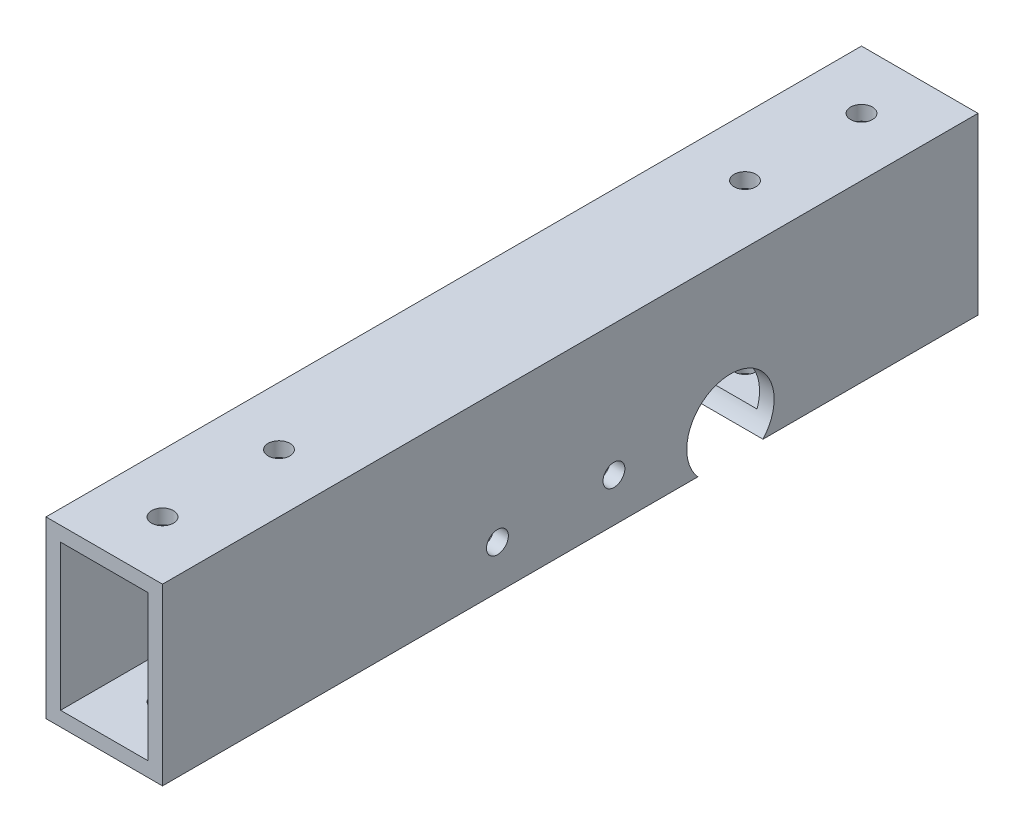
ISO-10303-21;
HEADER;
FILE_DESCRIPTION(('STEP AP214'),'2;1');
FILE_NAME('part.step','',(''),(''),'','','');
FILE_SCHEMA(('AUTOMOTIVE_DESIGN { 1 0 10303 214 1 1 1 1 }'));
ENDSEC;
DATA;
#1=APPLICATION_CONTEXT('core data for automotive mechanical design processes');
#2=APPLICATION_PROTOCOL_DEFINITION('international standard','automotive_design',2000,#1);
#3=PRODUCT_CONTEXT('',#1,'mechanical');
#4=PRODUCT('Part','Part','',(#3));
#5=PRODUCT_RELATED_PRODUCT_CATEGORY('part','',(#4));
#6=PRODUCT_DEFINITION_FORMATION('','',#4);
#7=PRODUCT_DEFINITION_CONTEXT('part definition',#1,'design');
#8=PRODUCT_DEFINITION('design','',#6,#7);
#9=PRODUCT_DEFINITION_SHAPE('','',#8);
#10=(LENGTH_UNIT() NAMED_UNIT(*) SI_UNIT(.MILLI.,.METRE.));
#11=(NAMED_UNIT(*) PLANE_ANGLE_UNIT() SI_UNIT($,.RADIAN.));
#12=(NAMED_UNIT(*) SI_UNIT($,.STERADIAN.) SOLID_ANGLE_UNIT());
#13=UNCERTAINTY_MEASURE_WITH_UNIT(LENGTH_MEASURE(1.E-05),#10,'distance_accuracy_value','');
#14=(GEOMETRIC_REPRESENTATION_CONTEXT(3) GLOBAL_UNCERTAINTY_ASSIGNED_CONTEXT((#13)) GLOBAL_UNIT_ASSIGNED_CONTEXT((#10,
#11,#12)) REPRESENTATION_CONTEXT('',''));
#15=CARTESIAN_POINT('',(0.,0.,0.));
#16=DIRECTION('',(0.,0.,1.));
#17=DIRECTION('',(1.,0.,0.));
#18=AXIS2_PLACEMENT_3D('',#15,#16,#17);
#19=CARTESIAN_POINT('',(-12.7,-19.05,177.8));
#20=DIRECTION('',(0.,1.,0.));
#21=DIRECTION('',(0.,0.,1.));
#22=AXIS2_PLACEMENT_3D('',#19,#20,#21);
#23=PLANE('',#22);
#24=CARTESIAN_POINT('',(0.,-19.05,165.1));
#25=DIRECTION('',(0.,1.,0.));
#26=DIRECTION('',(0.,0.,1.));
#27=AXIS2_PLACEMENT_3D('',#24,#25,#26);
#28=CIRCLE('',#27,2.38125);
#29=CARTESIAN_POINT('',(0.,-19.05,167.48125));
#30=VERTEX_POINT('',#29);
#31=EDGE_CURVE('E232',#30,#30,#28,.T.);
#32=ORIENTED_EDGE('',*,*,#31,.T.);
#33=EDGE_LOOP('',(#32));
#34=FACE_BOUND('',#33,.T.);
#35=CARTESIAN_POINT('',(0.,-19.05,139.7));
#36=DIRECTION('',(0.,1.,0.));
#37=DIRECTION('',(0.,0.,1.));
#38=AXIS2_PLACEMENT_3D('',#35,#36,#37);
#39=CIRCLE('',#38,2.38125);
#40=CARTESIAN_POINT('',(0.,-19.05,142.08125));
#41=VERTEX_POINT('',#40);
#42=EDGE_CURVE('E285',#41,#41,#39,.T.);
#43=ORIENTED_EDGE('',*,*,#42,.T.);
#44=EDGE_LOOP('',(#43));
#45=FACE_BOUND('',#44,.T.);
#46=DIRECTION('',(0.,0.,-1.));
#47=VECTOR('',#46,1.);
#48=CARTESIAN_POINT('',(-12.7,-19.05,177.8));
#49=LINE('',#48,#47);
#50=CARTESIAN_POINT('',(-12.7,-19.05,177.8));
#51=VERTEX_POINT('',#50);
#52=CARTESIAN_POINT('',(-12.7,-19.05,61.0745158285618));
#53=VERTEX_POINT('',#52);
#54=EDGE_CURVE('E162',#51,#53,#49,.T.);
#55=ORIENTED_EDGE('',*,*,#54,.T.);
#56=DIRECTION('',(1.,0.,0.));
#57=VECTOR('',#56,1.);
#58=CARTESIAN_POINT('',(-12.7,-19.05,61.0745158285618));
#59=LINE('',#58,#57);
#60=CARTESIAN_POINT('',(12.7,-19.05,61.0745158285618));
#61=VERTEX_POINT('',#60);
#62=EDGE_CURVE('E146',#53,#61,#59,.T.);
#63=ORIENTED_EDGE('',*,*,#62,.T.);
#64=DIRECTION('',(0.,0.,-1.));
#65=VECTOR('',#64,1.);
#66=CARTESIAN_POINT('',(12.7,-19.05,177.8));
#67=LINE('',#66,#65);
#68=CARTESIAN_POINT('',(12.7,-19.05,177.8));
#69=VERTEX_POINT('',#68);
#70=EDGE_CURVE('E179',#69,#61,#67,.T.);
#71=ORIENTED_EDGE('',*,*,#70,.F.);
#72=DIRECTION('',(1.,0.,0.));
#73=VECTOR('',#72,1.);
#74=CARTESIAN_POINT('',(-12.7,-19.05,177.8));
#75=LINE('',#74,#73);
#76=EDGE_CURVE('E169',#51,#69,#75,.T.);
#77=ORIENTED_EDGE('',*,*,#76,.F.);
#78=EDGE_LOOP('',(#55,#63,#71,#77));
#79=FACE_BOUND('',#78,.T.);
#80=ADVANCED_FACE('F56',(#34,#45,#79),#23,.F.);
#81=CARTESIAN_POINT('',(-12.7,-15.875,177.8));
#82=DIRECTION('',(0.,1.,0.));
#83=DIRECTION('',(0.,0.,1.));
#84=AXIS2_PLACEMENT_3D('',#81,#82,#83);
#85=PLANE('',#84);
#86=CARTESIAN_POINT('',(0.,-15.875,165.1));
#87=DIRECTION('',(0.,1.,0.));
#88=DIRECTION('',(0.,0.,1.));
#89=AXIS2_PLACEMENT_3D('',#86,#87,#88);
#90=CIRCLE('',#89,2.38125);
#91=CARTESIAN_POINT('',(0.,-15.875,167.48125));
#92=VERTEX_POINT('',#91);
#93=EDGE_CURVE('E236',#92,#92,#90,.T.);
#94=ORIENTED_EDGE('',*,*,#93,.F.);
#95=EDGE_LOOP('',(#94));
#96=FACE_BOUND('',#95,.T.);
#97=CARTESIAN_POINT('',(0.,-15.875,139.7));
#98=DIRECTION('',(0.,1.,0.));
#99=DIRECTION('',(0.,0.,1.));
#100=AXIS2_PLACEMENT_3D('',#97,#98,#99);
#101=CIRCLE('',#100,2.38125);
#102=CARTESIAN_POINT('',(0.,-15.875,142.08125));
#103=VERTEX_POINT('',#102);
#104=EDGE_CURVE('E231',#103,#103,#101,.T.);
#105=ORIENTED_EDGE('',*,*,#104,.F.);
#106=EDGE_LOOP('',(#105));
#107=FACE_BOUND('',#106,.T.);
#108=DIRECTION('',(1.,0.,0.));
#109=VECTOR('',#108,1.);
#110=CARTESIAN_POINT('',(-12.7,-15.875,62.9552561210692));
#111=LINE('',#110,#109);
#112=CARTESIAN_POINT('',(-9.525,-15.875,62.9552561210692));
#113=VERTEX_POINT('',#112);
#114=CARTESIAN_POINT('',(9.525,-15.875,62.9552561210692));
#115=VERTEX_POINT('',#114);
#116=EDGE_CURVE('E12',#113,#115,#111,.T.);
#117=ORIENTED_EDGE('',*,*,#116,.F.);
#118=DIRECTION('',(0.,0.,-1.));
#119=VECTOR('',#118,1.);
#120=CARTESIAN_POINT('',(-9.525,-15.875,177.8));
#121=LINE('',#120,#119);
#122=CARTESIAN_POINT('',(-9.525,-15.875,177.8));
#123=VERTEX_POINT('',#122);
#124=EDGE_CURVE('E314',#123,#113,#121,.T.);
#125=ORIENTED_EDGE('',*,*,#124,.F.);
#126=DIRECTION('',(1.,0.,0.));
#127=VECTOR('',#126,1.);
#128=CARTESIAN_POINT('',(-12.7,-15.875,177.8));
#129=LINE('',#128,#127);
#130=CARTESIAN_POINT('',(9.525,-15.875,177.8));
#131=VERTEX_POINT('',#130);
#132=EDGE_CURVE('E334',#123,#131,#129,.T.);
#133=ORIENTED_EDGE('',*,*,#132,.T.);
#134=DIRECTION('',(0.,0.,-1.));
#135=VECTOR('',#134,1.);
#136=CARTESIAN_POINT('',(9.525,-15.875,177.8));
#137=LINE('',#136,#135);
#138=EDGE_CURVE('E307',#131,#115,#137,.T.);
#139=ORIENTED_EDGE('',*,*,#138,.T.);
#140=EDGE_LOOP('',(#117,#125,#133,#139));
#141=FACE_BOUND('',#140,.T.);
#142=ADVANCED_FACE('F360',(#96,#107,#141),#85,.T.);
#143=CARTESIAN_POINT('',(12.7,19.05,177.8));
#144=DIRECTION('',(-1.,0.,0.));
#145=DIRECTION('',(0.,-1.,0.));
#146=AXIS2_PLACEMENT_3D('',#143,#144,#145);
#147=PLANE('',#146);
#148=CARTESIAN_POINT('',(12.7,-9.525,79.375));
#149=DIRECTION('',(1.,0.,0.));
#150=DIRECTION('',(0.,1.,0.));
#151=AXIS2_PLACEMENT_3D('',#148,#149,#150);
#152=CIRCLE('',#151,2.38125000000001);
#153=CARTESIAN_POINT('',(12.7,-7.14374999999999,79.375));
#154=VERTEX_POINT('',#153);
#155=EDGE_CURVE('E273',#154,#154,#152,.T.);
#156=ORIENTED_EDGE('',*,*,#155,.F.);
#157=EDGE_LOOP('',(#156));
#158=FACE_BOUND('',#157,.T.);
#159=CARTESIAN_POINT('',(12.7,-9.525,104.775));
#160=DIRECTION('',(1.,0.,0.));
#161=DIRECTION('',(0.,1.,0.));
#162=AXIS2_PLACEMENT_3D('',#159,#160,#161);
#163=CIRCLE('',#162,2.38125000000001);
#164=CARTESIAN_POINT('',(12.7,-7.14374999999999,104.775));
#165=VERTEX_POINT('',#164);
#166=EDGE_CURVE('E276',#165,#165,#163,.T.);
#167=ORIENTED_EDGE('',*,*,#166,.F.);
#168=EDGE_LOOP('',(#167));
#169=FACE_BOUND('',#168,.T.);
#170=ORIENTED_EDGE('',*,*,#70,.T.);
#171=CARTESIAN_POINT('',(12.7,-12.7,53.975));
#172=DIRECTION('',(1.,0.,0.));
#173=DIRECTION('',(0.,1.,0.));
#174=AXIS2_PLACEMENT_3D('',#171,#172,#173);
#175=CIRCLE('',#174,9.525);
#176=CARTESIAN_POINT('',(12.7,-19.05,46.8754841714382));
#177=VERTEX_POINT('',#176);
#178=EDGE_CURVE('E149',#177,#61,#175,.T.);
#179=ORIENTED_EDGE('',*,*,#178,.F.);
#180=CARTESIAN_POINT('',(12.7,-19.05,0.));
#181=VERTEX_POINT('',#180);
#182=EDGE_CURVE('E199',#177,#181,#67,.T.);
#183=ORIENTED_EDGE('',*,*,#182,.T.);
#184=DIRECTION('',(0.,1.,0.));
#185=VECTOR('',#184,1.);
#186=CARTESIAN_POINT('',(12.7,19.05,0.));
#187=LINE('',#186,#185);
#188=CARTESIAN_POINT('',(12.7,19.05,0.));
#189=VERTEX_POINT('',#188);
#190=EDGE_CURVE('E200',#181,#189,#187,.T.);
#191=ORIENTED_EDGE('',*,*,#190,.T.);
#192=DIRECTION('',(0.,0.,-1.));
#193=VECTOR('',#192,1.);
#194=CARTESIAN_POINT('',(12.7,19.05,177.8));
#195=LINE('',#194,#193);
#196=CARTESIAN_POINT('',(12.7,19.05,177.8));
#197=VERTEX_POINT('',#196);
#198=EDGE_CURVE('E176',#197,#189,#195,.T.);
#199=ORIENTED_EDGE('',*,*,#198,.F.);
#200=DIRECTION('',(0.,1.,0.));
#201=VECTOR('',#200,1.);
#202=CARTESIAN_POINT('',(12.7,19.05,177.8));
#203=LINE('',#202,#201);
#204=EDGE_CURVE('E195',#69,#197,#203,.T.);
#205=ORIENTED_EDGE('',*,*,#204,.F.);
#206=EDGE_LOOP('',(#170,#179,#183,#191,#199,#205));
#207=FACE_BOUND('',#206,.T.);
#208=ADVANCED_FACE('F58',(#158,#169,#207),#147,.F.);
#209=CARTESIAN_POINT('',(-12.7,19.05,177.8));
#210=DIRECTION('',(0.,-1.,0.));
#211=DIRECTION('',(0.,0.,-1.));
#212=AXIS2_PLACEMENT_3D('',#209,#210,#211);
#213=PLANE('',#212);
#214=CARTESIAN_POINT('',(0.,19.05,12.7));
#215=DIRECTION('',(0.,1.,0.));
#216=DIRECTION('',(0.,0.,1.));
#217=AXIS2_PLACEMENT_3D('',#214,#215,#216);
#218=CIRCLE('',#217,2.38125);
#219=CARTESIAN_POINT('',(0.,19.05,15.08125));
#220=VERTEX_POINT('',#219);
#221=EDGE_CURVE('E254',#220,#220,#218,.T.);
#222=ORIENTED_EDGE('',*,*,#221,.F.);
#223=EDGE_LOOP('',(#222));
#224=FACE_BOUND('',#223,.T.);
#225=CARTESIAN_POINT('',(0.,19.05,38.1));
#226=DIRECTION('',(0.,1.,0.));
#227=DIRECTION('',(0.,0.,1.));
#228=AXIS2_PLACEMENT_3D('',#225,#226,#227);
#229=CIRCLE('',#228,2.38125);
#230=CARTESIAN_POINT('',(0.,19.05,40.48125));
#231=VERTEX_POINT('',#230);
#232=EDGE_CURVE('E259',#231,#231,#229,.T.);
#233=ORIENTED_EDGE('',*,*,#232,.F.);
#234=EDGE_LOOP('',(#233));
#235=FACE_BOUND('',#234,.T.);
#236=CARTESIAN_POINT('',(0.,19.05,165.1));
#237=DIRECTION('',(0.,1.,0.));
#238=DIRECTION('',(0.,0.,1.));
#239=AXIS2_PLACEMENT_3D('',#236,#237,#238);
#240=CIRCLE('',#239,2.38125);
#241=CARTESIAN_POINT('',(0.,19.05,167.48125));
#242=VERTEX_POINT('',#241);
#243=EDGE_CURVE('E288',#242,#242,#240,.T.);
#244=ORIENTED_EDGE('',*,*,#243,.F.);
#245=EDGE_LOOP('',(#244));
#246=FACE_BOUND('',#245,.T.);
#247=CARTESIAN_POINT('',(0.,19.05,139.7));
#248=DIRECTION('',(0.,1.,0.));
#249=DIRECTION('',(0.,0.,1.));
#250=AXIS2_PLACEMENT_3D('',#247,#248,#249);
#251=CIRCLE('',#250,2.38125);
#252=CARTESIAN_POINT('',(0.,19.05,142.08125));
#253=VERTEX_POINT('',#252);
#254=EDGE_CURVE('E291',#253,#253,#251,.T.);
#255=ORIENTED_EDGE('',*,*,#254,.F.);
#256=EDGE_LOOP('',(#255));
#257=FACE_BOUND('',#256,.T.);
#258=DIRECTION('',(-1.,0.,0.));
#259=VECTOR('',#258,1.);
#260=CARTESIAN_POINT('',(-12.7,19.05,0.));
#261=LINE('',#260,#259);
#262=CARTESIAN_POINT('',(-12.7,19.05,0.));
#263=VERTEX_POINT('',#262);
#264=EDGE_CURVE('E202',#189,#263,#261,.T.);
#265=ORIENTED_EDGE('',*,*,#264,.T.);
#266=DIRECTION('',(0.,0.,-1.));
#267=VECTOR('',#266,1.);
#268=CARTESIAN_POINT('',(-12.7,19.05,177.8));
#269=LINE('',#268,#267);
#270=CARTESIAN_POINT('',(-12.7,19.05,177.8));
#271=VERTEX_POINT('',#270);
#272=EDGE_CURVE('E171',#271,#263,#269,.T.);
#273=ORIENTED_EDGE('',*,*,#272,.F.);
#274=DIRECTION('',(-1.,0.,0.));
#275=VECTOR('',#274,1.);
#276=CARTESIAN_POINT('',(-12.7,19.05,177.8));
#277=LINE('',#276,#275);
#278=EDGE_CURVE('E189',#197,#271,#277,.T.);
#279=ORIENTED_EDGE('',*,*,#278,.F.);
#280=ORIENTED_EDGE('',*,*,#198,.T.);
#281=EDGE_LOOP('',(#265,#273,#279,#280));
#282=FACE_BOUND('',#281,.T.);
#283=ADVANCED_FACE('F393',(#224,#235,#246,#257,#282),#213,.F.);
#284=CARTESIAN_POINT('',(-12.7,19.05,177.8));
#285=DIRECTION('',(1.,0.,0.));
#286=DIRECTION('',(0.,1.,0.));
#287=AXIS2_PLACEMENT_3D('',#284,#285,#286);
#288=PLANE('',#287);
#289=CARTESIAN_POINT('',(-12.7,-9.525,79.375));
#290=DIRECTION('',(1.,0.,0.));
#291=DIRECTION('',(0.,1.,0.));
#292=AXIS2_PLACEMENT_3D('',#289,#290,#291);
#293=CIRCLE('',#292,2.38125000000001);
#294=CARTESIAN_POINT('',(-12.7,-7.14375,79.375));
#295=VERTEX_POINT('',#294);
#296=EDGE_CURVE('E241',#295,#295,#293,.T.);
#297=ORIENTED_EDGE('',*,*,#296,.T.);
#298=EDGE_LOOP('',(#297));
#299=FACE_BOUND('',#298,.T.);
#300=CARTESIAN_POINT('',(-12.7,-9.525,104.775));
#301=DIRECTION('',(1.,0.,0.));
#302=DIRECTION('',(0.,1.,0.));
#303=AXIS2_PLACEMENT_3D('',#300,#301,#302);
#304=CIRCLE('',#303,2.38125000000001);
#305=CARTESIAN_POINT('',(-12.7,-7.14375,104.775));
#306=VERTEX_POINT('',#305);
#307=EDGE_CURVE('E270',#306,#306,#304,.T.);
#308=ORIENTED_EDGE('',*,*,#307,.T.);
#309=EDGE_LOOP('',(#308));
#310=FACE_BOUND('',#309,.T.);
#311=CARTESIAN_POINT('',(-12.7,-19.05,46.8754841714382));
#312=VERTEX_POINT('',#311);
#313=CARTESIAN_POINT('',(-12.7,-19.05,0.));
#314=VERTEX_POINT('',#313);
#315=EDGE_CURVE('E165',#312,#314,#49,.T.);
#316=ORIENTED_EDGE('',*,*,#315,.F.);
#317=CARTESIAN_POINT('',(-12.7,-12.7,53.975));
#318=DIRECTION('',(1.,0.,0.));
#319=DIRECTION('',(0.,1.,0.));
#320=AXIS2_PLACEMENT_3D('',#317,#318,#319);
#321=CIRCLE('',#320,9.525);
#322=EDGE_CURVE('E73',#312,#53,#321,.T.);
#323=ORIENTED_EDGE('',*,*,#322,.T.);
#324=ORIENTED_EDGE('',*,*,#54,.F.);
#325=DIRECTION('',(0.,-1.,0.));
#326=VECTOR('',#325,1.);
#327=CARTESIAN_POINT('',(-12.7,19.05,177.8));
#328=LINE('',#327,#326);
#329=EDGE_CURVE('E194',#271,#51,#328,.T.);
#330=ORIENTED_EDGE('',*,*,#329,.F.);
#331=ORIENTED_EDGE('',*,*,#272,.T.);
#332=DIRECTION('',(0.,-1.,0.));
#333=VECTOR('',#332,1.);
#334=CARTESIAN_POINT('',(-12.7,19.05,0.));
#335=LINE('',#334,#333);
#336=EDGE_CURVE('E207',#263,#314,#335,.T.);
#337=ORIENTED_EDGE('',*,*,#336,.T.);
#338=EDGE_LOOP('',(#316,#323,#324,#330,#331,#337));
#339=FACE_BOUND('',#338,.T.);
#340=ADVANCED_FACE('F160',(#299,#310,#339),#288,.F.);
#341=CARTESIAN_POINT('',(0.,-19.05,12.7));
#342=DIRECTION('',(0.,1.,0.));
#343=DIRECTION('',(0.,0.,1.));
#344=AXIS2_PLACEMENT_3D('',#341,#342,#343);
#345=CIRCLE('',#344,2.38125);
#346=CARTESIAN_POINT('',(0.,-19.05,15.08125));
#347=VERTEX_POINT('',#346);
#348=EDGE_CURVE('E248',#347,#347,#345,.T.);
#349=ORIENTED_EDGE('',*,*,#348,.T.);
#350=EDGE_LOOP('',(#349));
#351=FACE_BOUND('',#350,.T.);
#352=CARTESIAN_POINT('',(0.,-19.05,38.1));
#353=DIRECTION('',(0.,1.,0.));
#354=DIRECTION('',(0.,0.,1.));
#355=AXIS2_PLACEMENT_3D('',#352,#353,#354);
#356=CIRCLE('',#355,2.38125);
#357=CARTESIAN_POINT('',(0.,-19.05,40.48125));
#358=VERTEX_POINT('',#357);
#359=EDGE_CURVE('E264',#358,#358,#356,.T.);
#360=ORIENTED_EDGE('',*,*,#359,.T.);
#361=EDGE_LOOP('',(#360));
#362=FACE_BOUND('',#361,.T.);
#363=ORIENTED_EDGE('',*,*,#182,.F.);
#364=DIRECTION('',(1.,0.,0.));
#365=VECTOR('',#364,1.);
#366=CARTESIAN_POINT('',(-12.7,-19.05,46.8754841714382));
#367=LINE('',#366,#365);
#368=EDGE_CURVE('E155',#177,#312,#367,.F.);
#369=ORIENTED_EDGE('',*,*,#368,.T.);
#370=ORIENTED_EDGE('',*,*,#315,.T.);
#371=DIRECTION('',(1.,0.,0.));
#372=VECTOR('',#371,1.);
#373=CARTESIAN_POINT('',(-12.7,-19.05,0.));
#374=LINE('',#373,#372);
#375=EDGE_CURVE('E208',#314,#181,#374,.T.);
#376=ORIENTED_EDGE('',*,*,#375,.T.);
#377=EDGE_LOOP('',(#363,#369,#370,#376));
#378=FACE_BOUND('',#377,.T.);
#379=ADVANCED_FACE('F379',(#351,#362,#378),#23,.F.);
#380=CARTESIAN_POINT('',(0.,0.,177.8));
#381=DIRECTION('',(0.,0.,1.));
#382=DIRECTION('',(1.,0.,0.));
#383=AXIS2_PLACEMENT_3D('',#380,#381,#382);
#384=PLANE('',#383);
#385=DIRECTION('',(0.,1.,0.));
#386=VECTOR('',#385,1.);
#387=CARTESIAN_POINT('',(9.525,19.05,177.8));
#388=LINE('',#387,#386);
#389=CARTESIAN_POINT('',(9.525,15.875,177.8));
#390=VERTEX_POINT('',#389);
#391=EDGE_CURVE('E323',#131,#390,#388,.T.);
#392=ORIENTED_EDGE('',*,*,#391,.F.);
#393=ORIENTED_EDGE('',*,*,#132,.F.);
#394=DIRECTION('',(0.,-1.,0.));
#395=VECTOR('',#394,1.);
#396=CARTESIAN_POINT('',(-9.525,19.05,177.8));
#397=LINE('',#396,#395);
#398=CARTESIAN_POINT('',(-9.525,15.875,177.8));
#399=VERTEX_POINT('',#398);
#400=EDGE_CURVE('E332',#399,#123,#397,.T.);
#401=ORIENTED_EDGE('',*,*,#400,.F.);
#402=DIRECTION('',(-1.,0.,0.));
#403=VECTOR('',#402,1.);
#404=CARTESIAN_POINT('',(-12.7,15.875,177.8));
#405=LINE('',#404,#403);
#406=EDGE_CURVE('E330',#390,#399,#405,.T.);
#407=ORIENTED_EDGE('',*,*,#406,.F.);
#408=EDGE_LOOP('',(#392,#393,#401,#407));
#409=FACE_BOUND('',#408,.T.);
#410=ORIENTED_EDGE('',*,*,#204,.T.);
#411=ORIENTED_EDGE('',*,*,#278,.T.);
#412=ORIENTED_EDGE('',*,*,#329,.T.);
#413=ORIENTED_EDGE('',*,*,#76,.T.);
#414=EDGE_LOOP('',(#410,#411,#412,#413));
#415=FACE_BOUND('',#414,.T.);
#416=ADVANCED_FACE('F218',(#409,#415),#384,.T.);
#417=CARTESIAN_POINT('',(0.,0.,0.));
#418=DIRECTION('',(0.,0.,1.));
#419=DIRECTION('',(1.,0.,0.));
#420=AXIS2_PLACEMENT_3D('',#417,#418,#419);
#421=PLANE('',#420);
#422=DIRECTION('',(1.,0.,0.));
#423=VECTOR('',#422,1.);
#424=CARTESIAN_POINT('',(-12.7,-15.875,0.));
#425=LINE('',#424,#423);
#426=CARTESIAN_POINT('',(-9.525,-15.875,0.));
#427=VERTEX_POINT('',#426);
#428=CARTESIAN_POINT('',(9.525,-15.875,0.));
#429=VERTEX_POINT('',#428);
#430=EDGE_CURVE('E320',#427,#429,#425,.T.);
#431=ORIENTED_EDGE('',*,*,#430,.T.);
#432=DIRECTION('',(0.,1.,0.));
#433=VECTOR('',#432,1.);
#434=CARTESIAN_POINT('',(9.525,19.05,0.));
#435=LINE('',#434,#433);
#436=CARTESIAN_POINT('',(9.525,15.875,0.));
#437=VERTEX_POINT('',#436);
#438=EDGE_CURVE('E154',#429,#437,#435,.T.);
#439=ORIENTED_EDGE('',*,*,#438,.T.);
#440=DIRECTION('',(-1.,0.,0.));
#441=VECTOR('',#440,1.);
#442=CARTESIAN_POINT('',(-12.7,15.875,0.));
#443=LINE('',#442,#441);
#444=CARTESIAN_POINT('',(-9.525,15.875,0.));
#445=VERTEX_POINT('',#444);
#446=EDGE_CURVE('E319',#437,#445,#443,.T.);
#447=ORIENTED_EDGE('',*,*,#446,.T.);
#448=DIRECTION('',(0.,-1.,0.));
#449=VECTOR('',#448,1.);
#450=CARTESIAN_POINT('',(-9.525,19.05,0.));
#451=LINE('',#450,#449);
#452=EDGE_CURVE('E324',#445,#427,#451,.T.);
#453=ORIENTED_EDGE('',*,*,#452,.T.);
#454=EDGE_LOOP('',(#431,#439,#447,#453));
#455=FACE_BOUND('',#454,.T.);
#456=ORIENTED_EDGE('',*,*,#190,.F.);
#457=ORIENTED_EDGE('',*,*,#375,.F.);
#458=ORIENTED_EDGE('',*,*,#336,.F.);
#459=ORIENTED_EDGE('',*,*,#264,.F.);
#460=EDGE_LOOP('',(#456,#457,#458,#459));
#461=FACE_BOUND('',#460,.T.);
#462=ADVANCED_FACE('F348',(#455,#461),#421,.F.);
#463=CARTESIAN_POINT('',(9.525,19.05,177.8));
#464=DIRECTION('',(-1.,0.,0.));
#465=DIRECTION('',(0.,-1.,0.));
#466=AXIS2_PLACEMENT_3D('',#463,#464,#465);
#467=PLANE('',#466);
#468=CARTESIAN_POINT('',(9.525,-9.525,79.375));
#469=DIRECTION('',(-1.,0.,0.));
#470=DIRECTION('',(0.,-1.,0.));
#471=AXIS2_PLACEMENT_3D('',#468,#469,#470);
#472=CIRCLE('',#471,2.38125000000001);
#473=CARTESIAN_POINT('',(9.525,-11.90625,79.375));
#474=VERTEX_POINT('',#473);
#475=EDGE_CURVE('E244',#474,#474,#472,.T.);
#476=ORIENTED_EDGE('',*,*,#475,.F.);
#477=EDGE_LOOP('',(#476));
#478=FACE_BOUND('',#477,.T.);
#479=CARTESIAN_POINT('',(9.525,-9.525,104.775));
#480=DIRECTION('',(-1.,0.,0.));
#481=DIRECTION('',(0.,-1.,0.));
#482=AXIS2_PLACEMENT_3D('',#479,#480,#481);
#483=CIRCLE('',#482,2.38125000000001);
#484=CARTESIAN_POINT('',(9.525,-11.90625,104.775));
#485=VERTEX_POINT('',#484);
#486=EDGE_CURVE('E240',#485,#485,#483,.T.);
#487=ORIENTED_EDGE('',*,*,#486,.F.);
#488=EDGE_LOOP('',(#487));
#489=FACE_BOUND('',#488,.T.);
#490=CARTESIAN_POINT('',(9.525,-12.7,53.975));
#491=DIRECTION('',(-1.,0.,0.));
#492=DIRECTION('',(0.,-1.,0.));
#493=AXIS2_PLACEMENT_3D('',#490,#491,#492);
#494=CIRCLE('',#493,9.525);
#495=CARTESIAN_POINT('',(9.525,-15.875,44.9947438789308));
#496=VERTEX_POINT('',#495);
#497=EDGE_CURVE('E80',#115,#496,#494,.T.);
#498=ORIENTED_EDGE('',*,*,#497,.F.);
#499=ORIENTED_EDGE('',*,*,#138,.F.);
#500=ORIENTED_EDGE('',*,*,#391,.T.);
#501=DIRECTION('',(0.,0.,-1.));
#502=VECTOR('',#501,1.);
#503=CARTESIAN_POINT('',(9.525,15.875,177.8));
#504=LINE('',#503,#502);
#505=EDGE_CURVE('E203',#390,#437,#504,.T.);
#506=ORIENTED_EDGE('',*,*,#505,.T.);
#507=ORIENTED_EDGE('',*,*,#438,.F.);
#508=EDGE_CURVE('E311',#496,#429,#137,.T.);
#509=ORIENTED_EDGE('',*,*,#508,.F.);
#510=EDGE_LOOP('',(#498,#499,#500,#506,#507,#509));
#511=FACE_BOUND('',#510,.T.);
#512=ADVANCED_FACE('F345',(#478,#489,#511),#467,.T.);
#513=CARTESIAN_POINT('',(-12.7,15.875,177.8));
#514=DIRECTION('',(0.,-1.,0.));
#515=DIRECTION('',(0.,0.,-1.));
#516=AXIS2_PLACEMENT_3D('',#513,#514,#515);
#517=PLANE('',#516);
#518=CARTESIAN_POINT('',(0.,15.875,12.7));
#519=DIRECTION('',(0.,-1.,0.));
#520=DIRECTION('',(0.,0.,-1.));
#521=AXIS2_PLACEMENT_3D('',#518,#519,#520);
#522=CIRCLE('',#521,2.38125);
#523=CARTESIAN_POINT('',(0.,15.875,10.31875));
#524=VERTEX_POINT('',#523);
#525=EDGE_CURVE('E267',#524,#524,#522,.T.);
#526=ORIENTED_EDGE('',*,*,#525,.F.);
#527=EDGE_LOOP('',(#526));
#528=FACE_BOUND('',#527,.T.);
#529=CARTESIAN_POINT('',(0.,15.875,38.1));
#530=DIRECTION('',(0.,-1.,0.));
#531=DIRECTION('',(0.,0.,-1.));
#532=AXIS2_PLACEMENT_3D('',#529,#530,#531);
#533=CIRCLE('',#532,2.38125);
#534=CARTESIAN_POINT('',(0.,15.875,35.71875));
#535=VERTEX_POINT('',#534);
#536=EDGE_CURVE('E247',#535,#535,#533,.T.);
#537=ORIENTED_EDGE('',*,*,#536,.F.);
#538=EDGE_LOOP('',(#537));
#539=FACE_BOUND('',#538,.T.);
#540=CARTESIAN_POINT('',(0.,15.875,165.1));
#541=DIRECTION('',(0.,-1.,0.));
#542=DIRECTION('',(0.,0.,-1.));
#543=AXIS2_PLACEMENT_3D('',#540,#541,#542);
#544=CIRCLE('',#543,2.38125);
#545=CARTESIAN_POINT('',(0.,15.875,162.71875));
#546=VERTEX_POINT('',#545);
#547=EDGE_CURVE('E233',#546,#546,#544,.T.);
#548=ORIENTED_EDGE('',*,*,#547,.F.);
#549=EDGE_LOOP('',(#548));
#550=FACE_BOUND('',#549,.T.);
#551=CARTESIAN_POINT('',(0.,15.875,139.7));
#552=DIRECTION('',(0.,-1.,0.));
#553=DIRECTION('',(0.,0.,-1.));
#554=AXIS2_PLACEMENT_3D('',#551,#552,#553);
#555=CIRCLE('',#554,2.38125);
#556=CARTESIAN_POINT('',(0.,15.875,137.31875));
#557=VERTEX_POINT('',#556);
#558=EDGE_CURVE('E228',#557,#557,#555,.T.);
#559=ORIENTED_EDGE('',*,*,#558,.F.);
#560=EDGE_LOOP('',(#559));
#561=FACE_BOUND('',#560,.T.);
#562=ORIENTED_EDGE('',*,*,#446,.F.);
#563=ORIENTED_EDGE('',*,*,#505,.F.);
#564=ORIENTED_EDGE('',*,*,#406,.T.);
#565=DIRECTION('',(0.,0.,-1.));
#566=VECTOR('',#565,1.);
#567=CARTESIAN_POINT('',(-9.525,15.875,177.8));
#568=LINE('',#567,#566);
#569=EDGE_CURVE('E306',#399,#445,#568,.T.);
#570=ORIENTED_EDGE('',*,*,#569,.T.);
#571=EDGE_LOOP('',(#562,#563,#564,#570));
#572=FACE_BOUND('',#571,.T.);
#573=ADVANCED_FACE('F355',(#528,#539,#550,#561,#572),#517,.T.);
#574=CARTESIAN_POINT('',(-9.525,19.05,177.8));
#575=DIRECTION('',(1.,0.,0.));
#576=DIRECTION('',(0.,1.,0.));
#577=AXIS2_PLACEMENT_3D('',#574,#575,#576);
#578=PLANE('',#577);
#579=CARTESIAN_POINT('',(-9.525,-9.525,79.375));
#580=DIRECTION('',(1.,0.,0.));
#581=DIRECTION('',(0.,1.,0.));
#582=AXIS2_PLACEMENT_3D('',#579,#580,#581);
#583=CIRCLE('',#582,2.38125000000001);
#584=CARTESIAN_POINT('',(-9.525,-7.14375,79.375));
#585=VERTEX_POINT('',#584);
#586=EDGE_CURVE('E242',#585,#585,#583,.T.);
#587=ORIENTED_EDGE('',*,*,#586,.F.);
#588=EDGE_LOOP('',(#587));
#589=FACE_BOUND('',#588,.T.);
#590=CARTESIAN_POINT('',(-9.525,-9.525,104.775));
#591=DIRECTION('',(1.,0.,0.));
#592=DIRECTION('',(0.,1.,0.));
#593=AXIS2_PLACEMENT_3D('',#590,#591,#592);
#594=CIRCLE('',#593,2.38125000000001);
#595=CARTESIAN_POINT('',(-9.525,-7.14375,104.775));
#596=VERTEX_POINT('',#595);
#597=EDGE_CURVE('E237',#596,#596,#594,.T.);
#598=ORIENTED_EDGE('',*,*,#597,.F.);
#599=EDGE_LOOP('',(#598));
#600=FACE_BOUND('',#599,.T.);
#601=CARTESIAN_POINT('',(-9.525,-12.7,53.975));
#602=DIRECTION('',(1.,0.,0.));
#603=DIRECTION('',(0.,1.,0.));
#604=AXIS2_PLACEMENT_3D('',#601,#602,#603);
#605=CIRCLE('',#604,9.525);
#606=CARTESIAN_POINT('',(-9.525,-15.875,44.9947438789308));
#607=VERTEX_POINT('',#606);
#608=EDGE_CURVE('E167',#607,#113,#605,.T.);
#609=ORIENTED_EDGE('',*,*,#608,.F.);
#610=EDGE_CURVE('E310',#607,#427,#121,.T.);
#611=ORIENTED_EDGE('',*,*,#610,.T.);
#612=ORIENTED_EDGE('',*,*,#452,.F.);
#613=ORIENTED_EDGE('',*,*,#569,.F.);
#614=ORIENTED_EDGE('',*,*,#400,.T.);
#615=ORIENTED_EDGE('',*,*,#124,.T.);
#616=EDGE_LOOP('',(#609,#611,#612,#613,#614,#615));
#617=FACE_BOUND('',#616,.T.);
#618=ADVANCED_FACE('F352',(#589,#600,#617),#578,.T.);
#619=CARTESIAN_POINT('',(0.,-15.875,12.7));
#620=DIRECTION('',(0.,1.,0.));
#621=DIRECTION('',(0.,0.,1.));
#622=AXIS2_PLACEMENT_3D('',#619,#620,#621);
#623=CIRCLE('',#622,2.38125);
#624=CARTESIAN_POINT('',(0.,-15.875,15.08125));
#625=VERTEX_POINT('',#624);
#626=EDGE_CURVE('E60',#625,#625,#623,.T.);
#627=ORIENTED_EDGE('',*,*,#626,.F.);
#628=EDGE_LOOP('',(#627));
#629=FACE_BOUND('',#628,.T.);
#630=CARTESIAN_POINT('',(0.,-15.875,38.1));
#631=DIRECTION('',(0.,1.,0.));
#632=DIRECTION('',(0.,0.,1.));
#633=AXIS2_PLACEMENT_3D('',#630,#631,#632);
#634=CIRCLE('',#633,2.38125);
#635=CARTESIAN_POINT('',(0.,-15.875,40.48125));
#636=VERTEX_POINT('',#635);
#637=EDGE_CURVE('E245',#636,#636,#634,.T.);
#638=ORIENTED_EDGE('',*,*,#637,.F.);
#639=EDGE_LOOP('',(#638));
#640=FACE_BOUND('',#639,.T.);
#641=DIRECTION('',(1.,0.,0.));
#642=VECTOR('',#641,1.);
#643=CARTESIAN_POINT('',(-12.7,-15.875,44.9947438789308));
#644=LINE('',#643,#642);
#645=EDGE_CURVE('E65',#496,#607,#644,.F.);
#646=ORIENTED_EDGE('',*,*,#645,.F.);
#647=ORIENTED_EDGE('',*,*,#508,.T.);
#648=ORIENTED_EDGE('',*,*,#430,.F.);
#649=ORIENTED_EDGE('',*,*,#610,.F.);
#650=EDGE_LOOP('',(#646,#647,#648,#649));
#651=FACE_BOUND('',#650,.T.);
#652=ADVANCED_FACE('F342',(#629,#640,#651),#85,.T.);
#653=CARTESIAN_POINT('',(-12.7,-12.7,53.975));
#654=DIRECTION('',(1.,0.,0.));
#655=DIRECTION('',(0.,1.,0.));
#656=AXIS2_PLACEMENT_3D('',#653,#654,#655);
#657=CYLINDRICAL_SURFACE('',#656,9.525);
#658=ORIENTED_EDGE('',*,*,#116,.T.);
#659=ORIENTED_EDGE('',*,*,#497,.T.);
#660=ORIENTED_EDGE('',*,*,#645,.T.);
#661=ORIENTED_EDGE('',*,*,#608,.T.);
#662=EDGE_LOOP('',(#658,#659,#660,#661));
#663=FACE_BOUND('',#662,.T.);
#664=ORIENTED_EDGE('',*,*,#322,.F.);
#665=ORIENTED_EDGE('',*,*,#368,.F.);
#666=ORIENTED_EDGE('',*,*,#178,.T.);
#667=ORIENTED_EDGE('',*,*,#62,.F.);
#668=EDGE_LOOP('',(#664,#665,#666,#667));
#669=FACE_BOUND('',#668,.T.);
#670=ADVANCED_FACE('F147',(#663,#669),#657,.F.);
#671=CARTESIAN_POINT('',(0.,-19.05,139.7));
#672=DIRECTION('',(0.,1.,0.));
#673=DIRECTION('',(0.,0.,1.));
#674=AXIS2_PLACEMENT_3D('',#671,#672,#673);
#675=CYLINDRICAL_SURFACE('',#674,2.38125);
#676=ORIENTED_EDGE('',*,*,#558,.T.);
#677=EDGE_LOOP('',(#676));
#678=FACE_BOUND('',#677,.T.);
#679=ORIENTED_EDGE('',*,*,#254,.T.);
#680=EDGE_LOOP('',(#679));
#681=FACE_BOUND('',#680,.T.);
#682=ADVANCED_FACE('F362',(#678,#681),#675,.F.);
#683=CARTESIAN_POINT('',(0.,-19.05,165.1));
#684=DIRECTION('',(0.,1.,0.));
#685=DIRECTION('',(0.,0.,1.));
#686=AXIS2_PLACEMENT_3D('',#683,#684,#685);
#687=CYLINDRICAL_SURFACE('',#686,2.38125);
#688=ORIENTED_EDGE('',*,*,#547,.T.);
#689=EDGE_LOOP('',(#688));
#690=FACE_BOUND('',#689,.T.);
#691=ORIENTED_EDGE('',*,*,#243,.T.);
#692=EDGE_LOOP('',(#691));
#693=FACE_BOUND('',#692,.T.);
#694=ADVANCED_FACE('F369',(#690,#693),#687,.F.);
#695=ORIENTED_EDGE('',*,*,#104,.T.);
#696=EDGE_LOOP('',(#695));
#697=FACE_BOUND('',#696,.T.);
#698=ORIENTED_EDGE('',*,*,#42,.F.);
#699=EDGE_LOOP('',(#698));
#700=FACE_BOUND('',#699,.T.);
#701=ADVANCED_FACE('F372',(#697,#700),#675,.F.);
#702=ORIENTED_EDGE('',*,*,#93,.T.);
#703=EDGE_LOOP('',(#702));
#704=FACE_BOUND('',#703,.T.);
#705=ORIENTED_EDGE('',*,*,#31,.F.);
#706=EDGE_LOOP('',(#705));
#707=FACE_BOUND('',#706,.T.);
#708=ADVANCED_FACE('F445',(#704,#707),#687,.F.);
#709=CARTESIAN_POINT('',(-12.7,-9.525,104.775));
#710=DIRECTION('',(1.,0.,0.));
#711=DIRECTION('',(0.,1.,0.));
#712=AXIS2_PLACEMENT_3D('',#709,#710,#711);
#713=CYLINDRICAL_SURFACE('',#712,2.38125000000001);
#714=ORIENTED_EDGE('',*,*,#597,.T.);
#715=EDGE_LOOP('',(#714));
#716=FACE_BOUND('',#715,.T.);
#717=ORIENTED_EDGE('',*,*,#307,.F.);
#718=EDGE_LOOP('',(#717));
#719=FACE_BOUND('',#718,.T.);
#720=ADVANCED_FACE('F440',(#716,#719),#713,.F.);
#721=CARTESIAN_POINT('',(-12.7,-9.525,79.375));
#722=DIRECTION('',(1.,0.,0.));
#723=DIRECTION('',(0.,1.,0.));
#724=AXIS2_PLACEMENT_3D('',#721,#722,#723);
#725=CYLINDRICAL_SURFACE('',#724,2.38125000000001);
#726=ORIENTED_EDGE('',*,*,#586,.T.);
#727=EDGE_LOOP('',(#726));
#728=FACE_BOUND('',#727,.T.);
#729=ORIENTED_EDGE('',*,*,#296,.F.);
#730=EDGE_LOOP('',(#729));
#731=FACE_BOUND('',#730,.T.);
#732=ADVANCED_FACE('F444',(#728,#731),#725,.F.);
#733=ORIENTED_EDGE('',*,*,#486,.T.);
#734=EDGE_LOOP('',(#733));
#735=FACE_BOUND('',#734,.T.);
#736=ORIENTED_EDGE('',*,*,#166,.T.);
#737=EDGE_LOOP('',(#736));
#738=FACE_BOUND('',#737,.T.);
#739=ADVANCED_FACE('F448',(#735,#738),#713,.F.);
#740=ORIENTED_EDGE('',*,*,#475,.T.);
#741=EDGE_LOOP('',(#740));
#742=FACE_BOUND('',#741,.T.);
#743=ORIENTED_EDGE('',*,*,#155,.T.);
#744=EDGE_LOOP('',(#743));
#745=FACE_BOUND('',#744,.T.);
#746=ADVANCED_FACE('F458',(#742,#745),#725,.F.);
#747=CARTESIAN_POINT('',(0.,-19.05,38.1));
#748=DIRECTION('',(0.,1.,0.));
#749=DIRECTION('',(0.,0.,1.));
#750=AXIS2_PLACEMENT_3D('',#747,#748,#749);
#751=CYLINDRICAL_SURFACE('',#750,2.38125);
#752=ORIENTED_EDGE('',*,*,#637,.T.);
#753=EDGE_LOOP('',(#752));
#754=FACE_BOUND('',#753,.T.);
#755=ORIENTED_EDGE('',*,*,#359,.F.);
#756=EDGE_LOOP('',(#755));
#757=FACE_BOUND('',#756,.T.);
#758=ADVANCED_FACE('F470',(#754,#757),#751,.F.);
#759=CARTESIAN_POINT('',(0.,-19.05,12.7));
#760=DIRECTION('',(0.,1.,0.));
#761=DIRECTION('',(0.,0.,1.));
#762=AXIS2_PLACEMENT_3D('',#759,#760,#761);
#763=CYLINDRICAL_SURFACE('',#762,2.38125);
#764=ORIENTED_EDGE('',*,*,#626,.T.);
#765=EDGE_LOOP('',(#764));
#766=FACE_BOUND('',#765,.T.);
#767=ORIENTED_EDGE('',*,*,#348,.F.);
#768=EDGE_LOOP('',(#767));
#769=FACE_BOUND('',#768,.T.);
#770=ADVANCED_FACE('F482',(#766,#769),#763,.F.);
#771=ORIENTED_EDGE('',*,*,#536,.T.);
#772=EDGE_LOOP('',(#771));
#773=FACE_BOUND('',#772,.T.);
#774=ORIENTED_EDGE('',*,*,#232,.T.);
#775=EDGE_LOOP('',(#774));
#776=FACE_BOUND('',#775,.T.);
#777=ADVANCED_FACE('F484',(#773,#776),#751,.F.);
#778=ORIENTED_EDGE('',*,*,#525,.T.);
#779=EDGE_LOOP('',(#778));
#780=FACE_BOUND('',#779,.T.);
#781=ORIENTED_EDGE('',*,*,#221,.T.);
#782=EDGE_LOOP('',(#781));
#783=FACE_BOUND('',#782,.T.);
#784=ADVANCED_FACE('F494',(#780,#783),#763,.F.);
#785=CLOSED_SHELL('',(#80,#142,#208,#283,#340,#379,#416,#462,#512,#573,#618,#652,#670,#682,#694,
#701,#708,#720,#732,#739,#746,#758,#770,#777,#784));
#786=MANIFOLD_SOLID_BREP('B2',#785);
#787=ADVANCED_BREP_SHAPE_REPRESENTATION('',(#18,#786),#14);
#788=SHAPE_DEFINITION_REPRESENTATION(#9,#787);
ENDSEC;
END-ISO-10303-21;
